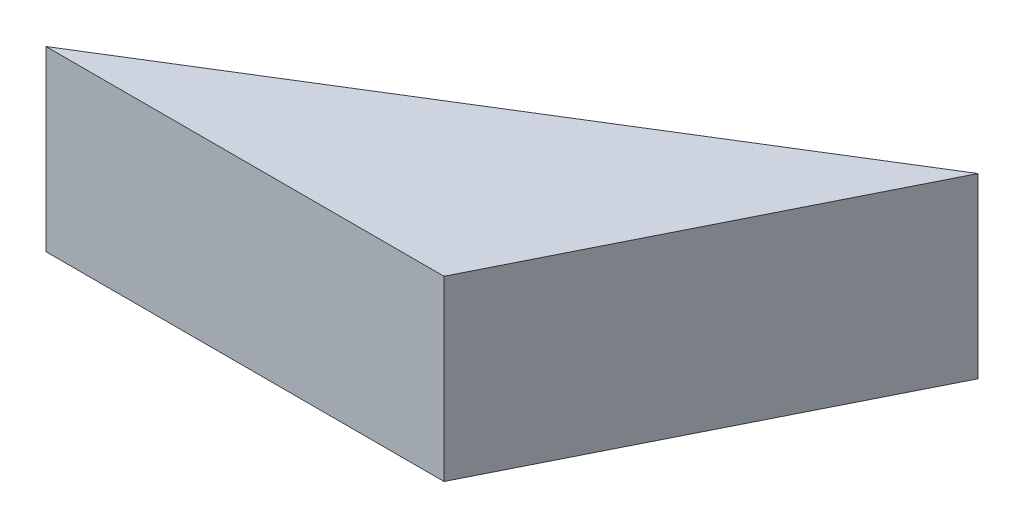
ISO-10303-21;
HEADER;
FILE_DESCRIPTION(('STEP AP214'),'2;1');
FILE_NAME('part.step','',(''),(''),'','','');
FILE_SCHEMA(('AUTOMOTIVE_DESIGN { 1 0 10303 214 1 1 1 1 }'));
ENDSEC;
DATA;
#1=APPLICATION_CONTEXT('core data for automotive mechanical design processes');
#2=APPLICATION_PROTOCOL_DEFINITION('international standard','automotive_design',2000,#1);
#3=PRODUCT_CONTEXT('',#1,'mechanical');
#4=PRODUCT('Part','Part','',(#3));
#5=PRODUCT_RELATED_PRODUCT_CATEGORY('part','',(#4));
#6=PRODUCT_DEFINITION_FORMATION('','',#4);
#7=PRODUCT_DEFINITION_CONTEXT('part definition',#1,'design');
#8=PRODUCT_DEFINITION('design','',#6,#7);
#9=PRODUCT_DEFINITION_SHAPE('','',#8);
#10=(LENGTH_UNIT() NAMED_UNIT(*) SI_UNIT(.MILLI.,.METRE.));
#11=(NAMED_UNIT(*) PLANE_ANGLE_UNIT() SI_UNIT($,.RADIAN.));
#12=(NAMED_UNIT(*) SI_UNIT($,.STERADIAN.) SOLID_ANGLE_UNIT());
#13=UNCERTAINTY_MEASURE_WITH_UNIT(LENGTH_MEASURE(1.E-05),#10,'distance_accuracy_value','');
#14=(GEOMETRIC_REPRESENTATION_CONTEXT(3) GLOBAL_UNCERTAINTY_ASSIGNED_CONTEXT((#13)) GLOBAL_UNIT_ASSIGNED_CONTEXT((#10,
#11,#12)) REPRESENTATION_CONTEXT('',''));
#15=CARTESIAN_POINT('',(0.,0.,0.));
#16=DIRECTION('',(0.,0.,1.));
#17=DIRECTION('',(1.,0.,0.));
#18=AXIS2_PLACEMENT_3D('',#15,#16,#17);
#19=CARTESIAN_POINT('',(0.,6.,0.));
#20=DIRECTION('',(0.,0.,1.));
#21=DIRECTION('',(1.,0.,0.));
#22=AXIS2_PLACEMENT_3D('',#19,#20,#21);
#23=PLANE('',#22);
#24=DIRECTION('',(-1.,0.,0.));
#25=VECTOR('',#24,1.);
#26=CARTESIAN_POINT('',(0.,0.,0.));
#27=LINE('',#26,#25);
#28=CARTESIAN_POINT('',(0.,0.,0.));
#29=VERTEX_POINT('',#28);
#30=CARTESIAN_POINT('',(-13.4345376665436,0.,0.));
#31=VERTEX_POINT('',#30);
#32=EDGE_CURVE('E85',#29,#31,#27,.T.);
#33=ORIENTED_EDGE('',*,*,#32,.F.);
#34=DIRECTION('',(0.,-1.,0.));
#35=VECTOR('',#34,1.);
#36=CARTESIAN_POINT('',(0.,6.,0.));
#37=LINE('',#36,#35);
#38=CARTESIAN_POINT('',(0.,6.,0.));
#39=VERTEX_POINT('',#38);
#40=EDGE_CURVE('E11',#39,#29,#37,.T.);
#41=ORIENTED_EDGE('',*,*,#40,.F.);
#42=DIRECTION('',(-1.,0.,0.));
#43=VECTOR('',#42,1.);
#44=CARTESIAN_POINT('',(0.,6.,0.));
#45=LINE('',#44,#43);
#46=CARTESIAN_POINT('',(-13.4345376665436,6.,0.));
#47=VERTEX_POINT('',#46);
#48=EDGE_CURVE('E72',#39,#47,#45,.T.);
#49=ORIENTED_EDGE('',*,*,#48,.T.);
#50=DIRECTION('',(0.,-1.,0.));
#51=VECTOR('',#50,1.);
#52=CARTESIAN_POINT('',(-13.4345376665436,6.,0.));
#53=LINE('',#52,#51);
#54=EDGE_CURVE('E36',#47,#31,#53,.T.);
#55=ORIENTED_EDGE('',*,*,#54,.T.);
#56=EDGE_LOOP('',(#33,#41,#49,#55));
#57=FACE_BOUND('',#56,.T.);
#58=ADVANCED_FACE('F33',(#57),#23,.T.);
#59=CARTESIAN_POINT('',(0.,6.,0.));
#60=DIRECTION('',(-0.894388560370085,0.,-0.447290848418708));
#61=DIRECTION('',(-0.447290848418708,0.,0.894388560370085));
#62=AXIS2_PLACEMENT_3D('',#59,#60,#61);
#63=PLANE('',#62);
#64=DIRECTION('',(0.447290848418708,0.,-0.894388560370085));
#65=VECTOR('',#64,1.);
#66=CARTESIAN_POINT('',(0.,0.,0.));
#67=LINE('',#66,#65);
#68=CARTESIAN_POINT('',(6.00914575098136,0.,-12.0156968028176));
#69=VERTEX_POINT('',#68);
#70=EDGE_CURVE('E63',#29,#69,#67,.T.);
#71=ORIENTED_EDGE('',*,*,#70,.T.);
#72=DIRECTION('',(0.,-1.,0.));
#73=VECTOR('',#72,1.);
#74=CARTESIAN_POINT('',(6.00914575098136,6.,-12.0156968028176));
#75=LINE('',#74,#73);
#76=CARTESIAN_POINT('',(6.00914575098136,6.,-12.0156968028176));
#77=VERTEX_POINT('',#76);
#78=EDGE_CURVE('E42',#77,#69,#75,.T.);
#79=ORIENTED_EDGE('',*,*,#78,.F.);
#80=DIRECTION('',(0.447290848418708,0.,-0.894388560370085));
#81=VECTOR('',#80,1.);
#82=CARTESIAN_POINT('',(0.,6.,0.));
#83=LINE('',#82,#81);
#84=EDGE_CURVE('E73',#39,#77,#83,.T.);
#85=ORIENTED_EDGE('',*,*,#84,.F.);
#86=ORIENTED_EDGE('',*,*,#40,.T.);
#87=EDGE_LOOP('',(#71,#79,#85,#86));
#88=FACE_BOUND('',#87,.T.);
#89=ADVANCED_FACE('F97',(#88),#63,.F.);
#90=CARTESIAN_POINT('',(6.00914575098136,6.,-12.0156968028176));
#91=DIRECTION('',(0.525694374889675,0.,0.850673512112229));
#92=DIRECTION('',(0.850673512112229,0.,-0.525694374889675));
#93=AXIS2_PLACEMENT_3D('',#90,#91,#92);
#94=PLANE('',#93);
#95=DIRECTION('',(-0.850673512112229,0.,0.525694374889675));
#96=VECTOR('',#95,1.);
#97=CARTESIAN_POINT('',(6.00914575098136,0.,-12.0156968028176));
#98=LINE('',#97,#96);
#99=EDGE_CURVE('E79',#69,#31,#98,.T.);
#100=ORIENTED_EDGE('',*,*,#99,.T.);
#101=ORIENTED_EDGE('',*,*,#54,.F.);
#102=DIRECTION('',(-0.850673512112229,0.,0.525694374889675));
#103=VECTOR('',#102,1.);
#104=CARTESIAN_POINT('',(6.00914575098136,6.,-12.0156968028176));
#105=LINE('',#104,#103);
#106=EDGE_CURVE('E69',#77,#47,#105,.T.);
#107=ORIENTED_EDGE('',*,*,#106,.F.);
#108=ORIENTED_EDGE('',*,*,#78,.T.);
#109=EDGE_LOOP('',(#100,#101,#107,#108));
#110=FACE_BOUND('',#109,.T.);
#111=ADVANCED_FACE('F77',(#110),#94,.F.);
#112=CARTESIAN_POINT('',(0.,6.,0.));
#113=DIRECTION('',(0.,-1.,0.));
#114=DIRECTION('',(0.,0.,-1.));
#115=AXIS2_PLACEMENT_3D('',#112,#113,#114);
#116=PLANE('',#115);
#117=ORIENTED_EDGE('',*,*,#48,.F.);
#118=ORIENTED_EDGE('',*,*,#84,.T.);
#119=ORIENTED_EDGE('',*,*,#106,.T.);
#120=EDGE_LOOP('',(#117,#118,#119));
#121=FACE_BOUND('',#120,.T.);
#122=ADVANCED_FACE('F71',(#121),#116,.F.);
#123=CARTESIAN_POINT('',(0.,0.,0.));
#124=DIRECTION('',(0.,-1.,0.));
#125=DIRECTION('',(0.,0.,-1.));
#126=AXIS2_PLACEMENT_3D('',#123,#124,#125);
#127=PLANE('',#126);
#128=ORIENTED_EDGE('',*,*,#32,.T.);
#129=ORIENTED_EDGE('',*,*,#99,.F.);
#130=ORIENTED_EDGE('',*,*,#70,.F.);
#131=EDGE_LOOP('',(#128,#129,#130));
#132=FACE_BOUND('',#131,.T.);
#133=ADVANCED_FACE('F88',(#132),#127,.T.);
#134=CLOSED_SHELL('',(#58,#89,#111,#122,#133));
#135=MANIFOLD_SOLID_BREP('B2',#134);
#136=ADVANCED_BREP_SHAPE_REPRESENTATION('',(#18,#135),#14);
#137=SHAPE_DEFINITION_REPRESENTATION(#9,#136);
ENDSEC;
END-ISO-10303-21;
